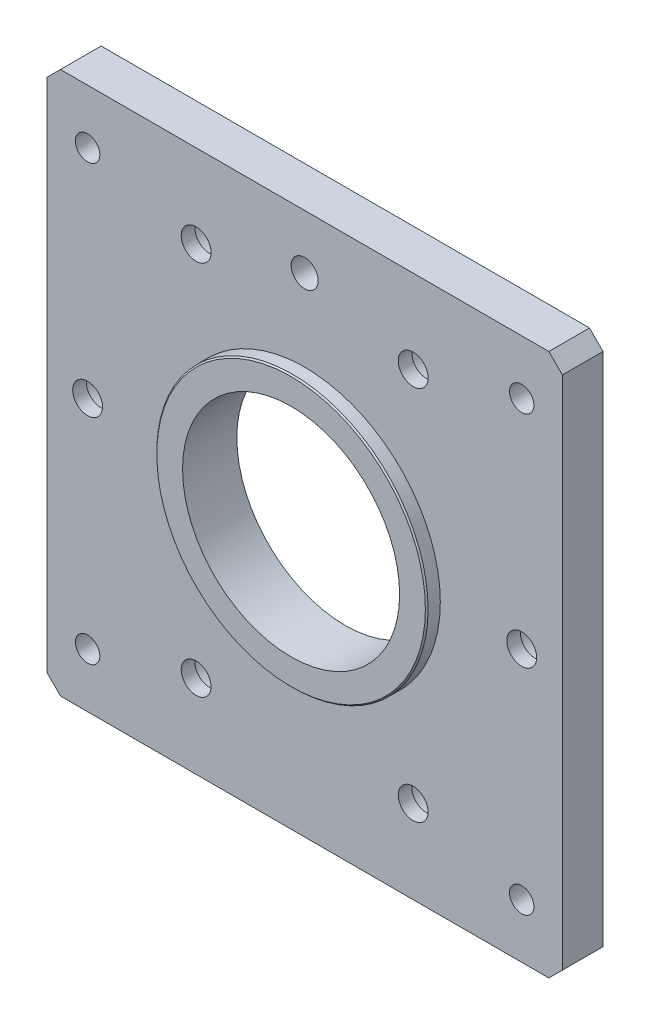
ISO-10303-21;
HEADER;
FILE_DESCRIPTION(('STEP AP214'),'2;1');
FILE_NAME('part.step','',(''),(''),'','','');
FILE_SCHEMA(('AUTOMOTIVE_DESIGN { 1 0 10303 214 1 1 1 1 }'));
ENDSEC;
DATA;
#1=APPLICATION_CONTEXT('core data for automotive mechanical design processes');
#2=APPLICATION_PROTOCOL_DEFINITION('international standard','automotive_design',2000,#1);
#3=PRODUCT_CONTEXT('',#1,'mechanical');
#4=PRODUCT('Part','Part','',(#3));
#5=PRODUCT_RELATED_PRODUCT_CATEGORY('part','',(#4));
#6=PRODUCT_DEFINITION_FORMATION('','',#4);
#7=PRODUCT_DEFINITION_CONTEXT('part definition',#1,'design');
#8=PRODUCT_DEFINITION('design','',#6,#7);
#9=PRODUCT_DEFINITION_SHAPE('','',#8);
#10=(LENGTH_UNIT() NAMED_UNIT(*) SI_UNIT(.MILLI.,.METRE.));
#11=(NAMED_UNIT(*) PLANE_ANGLE_UNIT() SI_UNIT($,.RADIAN.));
#12=(NAMED_UNIT(*) SI_UNIT($,.STERADIAN.) SOLID_ANGLE_UNIT());
#13=UNCERTAINTY_MEASURE_WITH_UNIT(LENGTH_MEASURE(1.E-05),#10,'distance_accuracy_value','');
#14=(GEOMETRIC_REPRESENTATION_CONTEXT(3) GLOBAL_UNCERTAINTY_ASSIGNED_CONTEXT((#13)) GLOBAL_UNIT_ASSIGNED_CONTEXT((#10,
#11,#12)) REPRESENTATION_CONTEXT('',''));
#15=CARTESIAN_POINT('',(0.,0.,0.));
#16=DIRECTION('',(0.,0.,1.));
#17=DIRECTION('',(1.,0.,0.));
#18=AXIS2_PLACEMENT_3D('',#15,#16,#17);
#19=CARTESIAN_POINT('',(0.,0.,0.));
#20=DIRECTION('',(0.,0.,1.));
#21=DIRECTION('',(1.,0.,0.));
#22=AXIS2_PLACEMENT_3D('',#19,#20,#21);
#23=PLANE('',#22);
#24=CARTESIAN_POINT('',(80.0000000000001,80.0000000000001,0.));
#25=DIRECTION('',(0.,0.,-1.));
#26=DIRECTION('',(-1.,0.,0.));
#27=AXIS2_PLACEMENT_3D('',#24,#25,#26);
#28=CIRCLE('',#27,4.5);
#29=CARTESIAN_POINT('',(75.5000000000001,80.0000000000001,0.));
#30=VERTEX_POINT('',#29);
#31=EDGE_CURVE('E202',#30,#30,#28,.T.);
#32=ORIENTED_EDGE('',*,*,#31,.F.);
#33=EDGE_LOOP('',(#32));
#34=FACE_BOUND('',#33,.T.);
#35=CARTESIAN_POINT('',(-80.0000000000001,80.0000000000001,0.));
#36=DIRECTION('',(0.,0.,-1.));
#37=DIRECTION('',(-1.,0.,0.));
#38=AXIS2_PLACEMENT_3D('',#35,#36,#37);
#39=CIRCLE('',#38,4.5);
#40=CARTESIAN_POINT('',(-84.5000000000001,80.0000000000001,0.));
#41=VERTEX_POINT('',#40);
#42=EDGE_CURVE('E192',#41,#41,#39,.T.);
#43=ORIENTED_EDGE('',*,*,#42,.F.);
#44=EDGE_LOOP('',(#43));
#45=FACE_BOUND('',#44,.T.);
#46=CARTESIAN_POINT('',(80.0000000000001,-80.0000000000001,0.));
#47=DIRECTION('',(0.,0.,-1.));
#48=DIRECTION('',(-1.,0.,0.));
#49=AXIS2_PLACEMENT_3D('',#46,#47,#48);
#50=CIRCLE('',#49,4.5);
#51=CARTESIAN_POINT('',(75.5000000000001,-80.0000000000001,0.));
#52=VERTEX_POINT('',#51);
#53=EDGE_CURVE('E189',#52,#52,#50,.T.);
#54=ORIENTED_EDGE('',*,*,#53,.F.);
#55=EDGE_LOOP('',(#54));
#56=FACE_BOUND('',#55,.T.);
#57=CARTESIAN_POINT('',(-80.0000000000001,-80.0000000000001,0.));
#58=DIRECTION('',(0.,0.,-1.));
#59=DIRECTION('',(-1.,0.,0.));
#60=AXIS2_PLACEMENT_3D('',#57,#58,#59);
#61=CIRCLE('',#60,4.5);
#62=CARTESIAN_POINT('',(-84.5000000000001,-80.0000000000001,0.));
#63=VERTEX_POINT('',#62);
#64=EDGE_CURVE('E188',#63,#63,#61,.T.);
#65=ORIENTED_EDGE('',*,*,#64,.F.);
#66=EDGE_LOOP('',(#65));
#67=FACE_BOUND('',#66,.T.);
#68=CARTESIAN_POINT('',(40.0000000000008,69.2820323027546,0.));
#69=DIRECTION('',(0.,0.,-1.));
#70=DIRECTION('',(-1.,0.,0.));
#71=AXIS2_PLACEMENT_3D('',#68,#69,#70);
#72=CIRCLE('',#71,9.);
#73=CARTESIAN_POINT('',(31.0000000000008,69.2820323027546,0.));
#74=VERTEX_POINT('',#73);
#75=EDGE_CURVE('E210',#74,#74,#72,.T.);
#76=ORIENTED_EDGE('',*,*,#75,.F.);
#77=EDGE_LOOP('',(#76));
#78=FACE_BOUND('',#77,.T.);
#79=CARTESIAN_POINT('',(80.,0.,0.));
#80=DIRECTION('',(0.,0.,-1.));
#81=DIRECTION('',(-1.,0.,0.));
#82=AXIS2_PLACEMENT_3D('',#79,#80,#81);
#83=CIRCLE('',#82,8.99999999999999);
#84=CARTESIAN_POINT('',(71.,0.,0.));
#85=VERTEX_POINT('',#84);
#86=EDGE_CURVE('E184',#85,#85,#83,.T.);
#87=ORIENTED_EDGE('',*,*,#86,.F.);
#88=EDGE_LOOP('',(#87));
#89=FACE_BOUND('',#88,.T.);
#90=CARTESIAN_POINT('',(-80.,5.62050406216485E-13,0.));
#91=DIRECTION('',(0.,0.,-1.));
#92=DIRECTION('',(-1.,0.,0.));
#93=AXIS2_PLACEMENT_3D('',#90,#91,#92);
#94=CIRCLE('',#93,8.99999999999999);
#95=CARTESIAN_POINT('',(-89.,5.62050406216485E-13,0.));
#96=VERTEX_POINT('',#95);
#97=EDGE_CURVE('E179',#96,#96,#94,.T.);
#98=ORIENTED_EDGE('',*,*,#97,.F.);
#99=EDGE_LOOP('',(#98));
#100=FACE_BOUND('',#99,.T.);
#101=CARTESIAN_POINT('',(-40.0000000000003,-69.2820323027549,0.));
#102=DIRECTION('',(0.,0.,-1.));
#103=DIRECTION('',(-1.,0.,0.));
#104=AXIS2_PLACEMENT_3D('',#101,#102,#103);
#105=CIRCLE('',#104,9.);
#106=CARTESIAN_POINT('',(-49.0000000000003,-69.2820323027549,0.));
#107=VERTEX_POINT('',#106);
#108=EDGE_CURVE('E174',#107,#107,#105,.T.);
#109=ORIENTED_EDGE('',*,*,#108,.F.);
#110=EDGE_LOOP('',(#109));
#111=FACE_BOUND('',#110,.T.);
#112=CARTESIAN_POINT('',(39.9999999999998,-69.2820323027552,0.));
#113=DIRECTION('',(0.,0.,-1.));
#114=DIRECTION('',(-1.,0.,0.));
#115=AXIS2_PLACEMENT_3D('',#112,#113,#114);
#116=CIRCLE('',#115,8.99999999999999);
#117=CARTESIAN_POINT('',(30.9999999999998,-69.2820323027552,0.));
#118=VERTEX_POINT('',#117);
#119=EDGE_CURVE('E169',#118,#118,#116,.T.);
#120=ORIENTED_EDGE('',*,*,#119,.F.);
#121=EDGE_LOOP('',(#120));
#122=FACE_BOUND('',#121,.T.);
#123=CARTESIAN_POINT('',(0.,0.,0.));
#124=DIRECTION('',(0.,0.,1.));
#125=DIRECTION('',(1.,0.,0.));
#126=AXIS2_PLACEMENT_3D('',#123,#124,#125);
#127=CIRCLE('',#126,40.);
#128=CARTESIAN_POINT('',(40.,0.,0.));
#129=VERTEX_POINT('',#128);
#130=EDGE_CURVE('E125',#129,#129,#127,.T.);
#131=ORIENTED_EDGE('',*,*,#130,.T.);
#132=EDGE_LOOP('',(#131));
#133=FACE_BOUND('',#132,.T.);
#134=CARTESIAN_POINT('',(0.,80.,0.));
#135=DIRECTION('',(0.,0.,1.));
#136=DIRECTION('',(1.,0.,0.));
#137=AXIS2_PLACEMENT_3D('',#134,#135,#136);
#138=CIRCLE('',#137,5.);
#139=CARTESIAN_POINT('',(5.,80.,0.));
#140=VERTEX_POINT('',#139);
#141=EDGE_CURVE('E265',#140,#140,#138,.T.);
#142=ORIENTED_EDGE('',*,*,#141,.T.);
#143=EDGE_LOOP('',(#142));
#144=FACE_BOUND('',#143,.T.);
#145=DIRECTION('',(0.,1.,0.));
#146=VECTOR('',#145,1.);
#147=CARTESIAN_POINT('',(94.9999999999999,100.,0.));
#148=LINE('',#147,#146);
#149=CARTESIAN_POINT('',(95.,-94.9999999999999,0.));
#150=VERTEX_POINT('',#149);
#151=CARTESIAN_POINT('',(94.9999999999999,94.9999999999999,0.));
#152=VERTEX_POINT('',#151);
#153=EDGE_CURVE('E270',#150,#152,#148,.T.);
#154=ORIENTED_EDGE('',*,*,#153,.F.);
#155=DIRECTION('',(0.707106781186548,0.707106781186547,0.));
#156=VECTOR('',#155,1.);
#157=CARTESIAN_POINT('',(95.,-94.9999999999999,0.));
#158=LINE('',#157,#156);
#159=CARTESIAN_POINT('',(89.9999999999999,-99.9999999999999,0.));
#160=VERTEX_POINT('',#159);
#161=EDGE_CURVE('E129',#150,#160,#158,.F.);
#162=ORIENTED_EDGE('',*,*,#161,.T.);
#163=DIRECTION('',(1.,0.,0.));
#164=VECTOR('',#163,1.);
#165=CARTESIAN_POINT('',(-95.,-99.9999999999999,0.));
#166=LINE('',#165,#164);
#167=CARTESIAN_POINT('',(-90.,-99.9999999999999,0.));
#168=VERTEX_POINT('',#167);
#169=EDGE_CURVE('E277',#168,#160,#166,.T.);
#170=ORIENTED_EDGE('',*,*,#169,.F.);
#171=DIRECTION('',(0.707106781186546,-0.70710678118655,0.));
#172=VECTOR('',#171,1.);
#173=CARTESIAN_POINT('',(-90.,-99.9999999999999,0.));
#174=LINE('',#173,#172);
#175=CARTESIAN_POINT('',(-95.,-94.9999999999998,0.));
#176=VERTEX_POINT('',#175);
#177=EDGE_CURVE('E139',#168,#176,#174,.F.);
#178=ORIENTED_EDGE('',*,*,#177,.T.);
#179=DIRECTION('',(0.,-1.,0.));
#180=VECTOR('',#179,1.);
#181=CARTESIAN_POINT('',(-95.0000000000001,100.,0.));
#182=LINE('',#181,#180);
#183=CARTESIAN_POINT('',(-95.0000000000001,95.0000000000001,0.));
#184=VERTEX_POINT('',#183);
#185=EDGE_CURVE('E275',#184,#176,#182,.T.);
#186=ORIENTED_EDGE('',*,*,#185,.F.);
#187=DIRECTION('',(-0.707106781186548,-0.707106781186548,0.));
#188=VECTOR('',#187,1.);
#189=CARTESIAN_POINT('',(-95.0000000000001,95.0000000000001,0.));
#190=LINE('',#189,#188);
#191=CARTESIAN_POINT('',(-90.0000000000001,100.,0.));
#192=VERTEX_POINT('',#191);
#193=EDGE_CURVE('E132',#184,#192,#190,.F.);
#194=ORIENTED_EDGE('',*,*,#193,.T.);
#195=DIRECTION('',(-1.,0.,0.));
#196=VECTOR('',#195,1.);
#197=CARTESIAN_POINT('',(-95.0000000000001,100.,0.));
#198=LINE('',#197,#196);
#199=CARTESIAN_POINT('',(89.9999999999998,100.,0.));
#200=VERTEX_POINT('',#199);
#201=EDGE_CURVE('E272',#200,#192,#198,.T.);
#202=ORIENTED_EDGE('',*,*,#201,.F.);
#203=DIRECTION('',(-0.707106781186547,0.707106781186549,0.));
#204=VECTOR('',#203,1.);
#205=CARTESIAN_POINT('',(89.9999999999998,100.,0.));
#206=LINE('',#205,#204);
#207=EDGE_CURVE('E130',#200,#152,#206,.F.);
#208=ORIENTED_EDGE('',*,*,#207,.T.);
#209=EDGE_LOOP('',(#154,#162,#170,#178,#186,#194,#202,#208));
#210=FACE_BOUND('',#209,.T.);
#211=CARTESIAN_POINT('',(-39.9999999999994,69.2820323027554,0.));
#212=DIRECTION('',(0.,0.,-1.));
#213=DIRECTION('',(-1.,0.,0.));
#214=AXIS2_PLACEMENT_3D('',#211,#212,#213);
#215=CIRCLE('',#214,9.);
#216=CARTESIAN_POINT('',(-48.9999999999993,69.2820323027554,0.));
#217=VERTEX_POINT('',#216);
#218=EDGE_CURVE('E164',#217,#217,#215,.T.);
#219=ORIENTED_EDGE('',*,*,#218,.F.);
#220=EDGE_LOOP('',(#219));
#221=FACE_BOUND('',#220,.T.);
#222=ADVANCED_FACE('F36',(#34,#45,#56,#67,#78,#89,#100,#111,#122,#133,#144,#210,#221),#23,.F.);
#223=CARTESIAN_POINT('',(0.,0.,20.));
#224=DIRECTION('',(0.,0.,1.));
#225=DIRECTION('',(1.,0.,0.));
#226=AXIS2_PLACEMENT_3D('',#223,#224,#225);
#227=PLANE('',#226);
#228=CARTESIAN_POINT('',(0.,0.,20.));
#229=DIRECTION('',(0.,0.,1.));
#230=DIRECTION('',(1.,0.,0.));
#231=AXIS2_PLACEMENT_3D('',#228,#229,#230);
#232=CIRCLE('',#231,49.5);
#233=CARTESIAN_POINT('',(49.5,0.,20.));
#234=VERTEX_POINT('',#233);
#235=EDGE_CURVE('E280',#234,#234,#232,.T.);
#236=ORIENTED_EDGE('',*,*,#235,.T.);
#237=EDGE_LOOP('',(#236));
#238=FACE_BOUND('',#237,.T.);
#239=CARTESIAN_POINT('',(0.,0.,20.));
#240=DIRECTION('',(0.,0.,1.));
#241=DIRECTION('',(1.,0.,0.));
#242=AXIS2_PLACEMENT_3D('',#239,#240,#241);
#243=CIRCLE('',#242,40.);
#244=CARTESIAN_POINT('',(40.,0.,20.));
#245=VERTEX_POINT('',#244);
#246=EDGE_CURVE('E262',#245,#245,#243,.T.);
#247=ORIENTED_EDGE('',*,*,#246,.F.);
#248=EDGE_LOOP('',(#247));
#249=FACE_BOUND('',#248,.T.);
#250=ADVANCED_FACE('F294',(#238,#249),#227,.T.);
#251=CARTESIAN_POINT('',(94.9999999999999,100.,20.));
#252=DIRECTION('',(-1.,0.,0.));
#253=DIRECTION('',(0.,-1.,0.));
#254=AXIS2_PLACEMENT_3D('',#251,#252,#253);
#255=PLANE('',#254);
#256=DIRECTION('',(0.,1.,0.));
#257=VECTOR('',#256,1.);
#258=CARTESIAN_POINT('',(94.9999999999999,100.,15.));
#259=LINE('',#258,#257);
#260=CARTESIAN_POINT('',(95.,-94.9999999999999,15.));
#261=VERTEX_POINT('',#260);
#262=CARTESIAN_POINT('',(94.9999999999999,94.9999999999999,15.));
#263=VERTEX_POINT('',#262);
#264=EDGE_CURVE('E107',#261,#263,#259,.T.);
#265=ORIENTED_EDGE('',*,*,#264,.F.);
#266=DIRECTION('',(0.,0.,-1.));
#267=VECTOR('',#266,1.);
#268=CARTESIAN_POINT('',(95.,-94.9999999999999,20.));
#269=LINE('',#268,#267);
#270=EDGE_CURVE('E121',#261,#150,#269,.T.);
#271=ORIENTED_EDGE('',*,*,#270,.T.);
#272=ORIENTED_EDGE('',*,*,#153,.T.);
#273=DIRECTION('',(0.,0.,1.));
#274=VECTOR('',#273,1.);
#275=CARTESIAN_POINT('',(94.9999999999999,94.9999999999999,20.));
#276=LINE('',#275,#274);
#277=EDGE_CURVE('E124',#152,#263,#276,.T.);
#278=ORIENTED_EDGE('',*,*,#277,.T.);
#279=EDGE_LOOP('',(#265,#271,#272,#278));
#280=FACE_BOUND('',#279,.T.);
#281=ADVANCED_FACE('F119',(#280),#255,.F.);
#282=CARTESIAN_POINT('',(-95.0000000000001,100.,20.));
#283=DIRECTION('',(0.,-1.,0.));
#284=DIRECTION('',(1.,0.,0.));
#285=AXIS2_PLACEMENT_3D('',#282,#283,#284);
#286=PLANE('',#285);
#287=ORIENTED_EDGE('',*,*,#201,.T.);
#288=DIRECTION('',(0.,0.,1.));
#289=VECTOR('',#288,1.);
#290=CARTESIAN_POINT('',(-90.0000000000001,100.,20.));
#291=LINE('',#290,#289);
#292=CARTESIAN_POINT('',(-90.0000000000001,100.,15.));
#293=VERTEX_POINT('',#292);
#294=EDGE_CURVE('E12',#192,#293,#291,.T.);
#295=ORIENTED_EDGE('',*,*,#294,.T.);
#296=DIRECTION('',(-1.,0.,0.));
#297=VECTOR('',#296,1.);
#298=CARTESIAN_POINT('',(-95.0000000000001,100.,15.));
#299=LINE('',#298,#297);
#300=CARTESIAN_POINT('',(89.9999999999998,100.,15.));
#301=VERTEX_POINT('',#300);
#302=EDGE_CURVE('E126',#301,#293,#299,.T.);
#303=ORIENTED_EDGE('',*,*,#302,.F.);
#304=DIRECTION('',(0.,0.,-1.));
#305=VECTOR('',#304,1.);
#306=CARTESIAN_POINT('',(89.9999999999998,100.,20.));
#307=LINE('',#306,#305);
#308=EDGE_CURVE('E45',#301,#200,#307,.T.);
#309=ORIENTED_EDGE('',*,*,#308,.T.);
#310=EDGE_LOOP('',(#287,#295,#303,#309));
#311=FACE_BOUND('',#310,.T.);
#312=ADVANCED_FACE('F353',(#311),#286,.F.);
#313=CARTESIAN_POINT('',(-95.0000000000001,100.,20.));
#314=DIRECTION('',(1.,0.,0.));
#315=DIRECTION('',(0.,1.,0.));
#316=AXIS2_PLACEMENT_3D('',#313,#314,#315);
#317=PLANE('',#316);
#318=ORIENTED_EDGE('',*,*,#185,.T.);
#319=DIRECTION('',(0.,0.,1.));
#320=VECTOR('',#319,1.);
#321=CARTESIAN_POINT('',(-95.,-94.9999999999998,20.));
#322=LINE('',#321,#320);
#323=CARTESIAN_POINT('',(-95.,-94.9999999999998,15.));
#324=VERTEX_POINT('',#323);
#325=EDGE_CURVE('E53',#176,#324,#322,.T.);
#326=ORIENTED_EDGE('',*,*,#325,.T.);
#327=DIRECTION('',(0.,-1.,0.));
#328=VECTOR('',#327,1.);
#329=CARTESIAN_POINT('',(-95.0000000000001,100.,15.));
#330=LINE('',#329,#328);
#331=CARTESIAN_POINT('',(-95.0000000000001,95.0000000000001,15.));
#332=VERTEX_POINT('',#331);
#333=EDGE_CURVE('E259',#332,#324,#330,.T.);
#334=ORIENTED_EDGE('',*,*,#333,.F.);
#335=DIRECTION('',(0.,0.,-1.));
#336=VECTOR('',#335,1.);
#337=CARTESIAN_POINT('',(-95.0000000000001,95.0000000000001,20.));
#338=LINE('',#337,#336);
#339=EDGE_CURVE('E114',#332,#184,#338,.T.);
#340=ORIENTED_EDGE('',*,*,#339,.T.);
#341=EDGE_LOOP('',(#318,#326,#334,#340));
#342=FACE_BOUND('',#341,.T.);
#343=ADVANCED_FACE('F349',(#342),#317,.F.);
#344=CARTESIAN_POINT('',(-95.,-99.9999999999999,20.));
#345=DIRECTION('',(0.,1.,0.));
#346=DIRECTION('',(0.,0.,1.));
#347=AXIS2_PLACEMENT_3D('',#344,#345,#346);
#348=PLANE('',#347);
#349=ORIENTED_EDGE('',*,*,#169,.T.);
#350=DIRECTION('',(0.,0.,1.));
#351=VECTOR('',#350,1.);
#352=CARTESIAN_POINT('',(89.9999999999999,-99.9999999999999,20.));
#353=LINE('',#352,#351);
#354=CARTESIAN_POINT('',(89.9999999999999,-99.9999999999999,15.));
#355=VERTEX_POINT('',#354);
#356=EDGE_CURVE('E145',#160,#355,#353,.T.);
#357=ORIENTED_EDGE('',*,*,#356,.T.);
#358=DIRECTION('',(1.,0.,0.));
#359=VECTOR('',#358,1.);
#360=CARTESIAN_POINT('',(-95.,-99.9999999999999,15.));
#361=LINE('',#360,#359);
#362=CARTESIAN_POINT('',(-90.,-99.9999999999999,15.));
#363=VERTEX_POINT('',#362);
#364=EDGE_CURVE('E110',#363,#355,#361,.T.);
#365=ORIENTED_EDGE('',*,*,#364,.F.);
#366=DIRECTION('',(0.,0.,-1.));
#367=VECTOR('',#366,1.);
#368=CARTESIAN_POINT('',(-90.,-99.9999999999999,20.));
#369=LINE('',#368,#367);
#370=EDGE_CURVE('E142',#363,#168,#369,.T.);
#371=ORIENTED_EDGE('',*,*,#370,.T.);
#372=EDGE_LOOP('',(#349,#357,#365,#371));
#373=FACE_BOUND('',#372,.T.);
#374=ADVANCED_FACE('F344',(#373),#348,.F.);
#375=CARTESIAN_POINT('',(0.,80.,20.));
#376=DIRECTION('',(0.,0.,-1.));
#377=DIRECTION('',(-1.,0.,0.));
#378=AXIS2_PLACEMENT_3D('',#375,#376,#377);
#379=CYLINDRICAL_SURFACE('',#378,5.);
#380=ORIENTED_EDGE('',*,*,#141,.F.);
#381=EDGE_LOOP('',(#380));
#382=FACE_BOUND('',#381,.T.);
#383=CARTESIAN_POINT('',(0.,80.,15.));
#384=DIRECTION('',(0.,0.,1.));
#385=DIRECTION('',(1.,0.,0.));
#386=AXIS2_PLACEMENT_3D('',#383,#384,#385);
#387=CIRCLE('',#386,5.);
#388=CARTESIAN_POINT('',(5.,80.,15.));
#389=VERTEX_POINT('',#388);
#390=EDGE_CURVE('E255',#389,#389,#387,.T.);
#391=ORIENTED_EDGE('',*,*,#390,.T.);
#392=EDGE_LOOP('',(#391));
#393=FACE_BOUND('',#392,.T.);
#394=ADVANCED_FACE('F303',(#382,#393),#379,.F.);
#395=CARTESIAN_POINT('',(0.,0.,20.));
#396=DIRECTION('',(0.,0.,-1.));
#397=DIRECTION('',(-1.,0.,0.));
#398=AXIS2_PLACEMENT_3D('',#395,#396,#397);
#399=CYLINDRICAL_SURFACE('',#398,40.);
#400=ORIENTED_EDGE('',*,*,#246,.T.);
#401=EDGE_LOOP('',(#400));
#402=FACE_BOUND('',#401,.T.);
#403=ORIENTED_EDGE('',*,*,#130,.F.);
#404=EDGE_LOOP('',(#403));
#405=FACE_BOUND('',#404,.T.);
#406=ADVANCED_FACE('F300',(#402,#405),#399,.F.);
#407=CARTESIAN_POINT('',(0.,0.,15.));
#408=DIRECTION('',(0.,0.,1.));
#409=DIRECTION('',(1.,0.,0.));
#410=AXIS2_PLACEMENT_3D('',#407,#408,#409);
#411=PLANE('',#410);
#412=CARTESIAN_POINT('',(80.0000000000001,80.0000000000001,15.));
#413=DIRECTION('',(0.,0.,1.));
#414=DIRECTION('',(1.,0.,0.));
#415=AXIS2_PLACEMENT_3D('',#412,#413,#414);
#416=CIRCLE('',#415,4.5);
#417=CARTESIAN_POINT('',(84.5000000000001,80.0000000000001,15.));
#418=VERTEX_POINT('',#417);
#419=EDGE_CURVE('E40',#418,#418,#416,.T.);
#420=ORIENTED_EDGE('',*,*,#419,.F.);
#421=EDGE_LOOP('',(#420));
#422=FACE_BOUND('',#421,.T.);
#423=CARTESIAN_POINT('',(-80.0000000000001,80.0000000000001,15.));
#424=DIRECTION('',(0.,0.,1.));
#425=DIRECTION('',(1.,0.,0.));
#426=AXIS2_PLACEMENT_3D('',#423,#424,#425);
#427=CIRCLE('',#426,4.5);
#428=CARTESIAN_POINT('',(-75.5000000000001,80.0000000000001,15.));
#429=VERTEX_POINT('',#428);
#430=EDGE_CURVE('E190',#429,#429,#427,.T.);
#431=ORIENTED_EDGE('',*,*,#430,.F.);
#432=EDGE_LOOP('',(#431));
#433=FACE_BOUND('',#432,.T.);
#434=CARTESIAN_POINT('',(80.0000000000001,-80.0000000000001,15.));
#435=DIRECTION('',(0.,0.,1.));
#436=DIRECTION('',(1.,0.,0.));
#437=AXIS2_PLACEMENT_3D('',#434,#435,#436);
#438=CIRCLE('',#437,4.5);
#439=CARTESIAN_POINT('',(84.5000000000001,-80.0000000000001,15.));
#440=VERTEX_POINT('',#439);
#441=EDGE_CURVE('E186',#440,#440,#438,.T.);
#442=ORIENTED_EDGE('',*,*,#441,.F.);
#443=EDGE_LOOP('',(#442));
#444=FACE_BOUND('',#443,.T.);
#445=CARTESIAN_POINT('',(-80.0000000000001,-80.0000000000001,15.));
#446=DIRECTION('',(0.,0.,1.));
#447=DIRECTION('',(1.,0.,0.));
#448=AXIS2_PLACEMENT_3D('',#445,#446,#447);
#449=CIRCLE('',#448,4.5);
#450=CARTESIAN_POINT('',(-75.5000000000001,-80.0000000000001,15.));
#451=VERTEX_POINT('',#450);
#452=EDGE_CURVE('E207',#451,#451,#449,.T.);
#453=ORIENTED_EDGE('',*,*,#452,.F.);
#454=EDGE_LOOP('',(#453));
#455=FACE_BOUND('',#454,.T.);
#456=CARTESIAN_POINT('',(40.0000000000008,69.2820323027546,15.));
#457=DIRECTION('',(0.,0.,1.));
#458=DIRECTION('',(1.,0.,0.));
#459=AXIS2_PLACEMENT_3D('',#456,#457,#458);
#460=CIRCLE('',#459,5.5);
#461=CARTESIAN_POINT('',(45.5000000000008,69.2820323027546,15.));
#462=VERTEX_POINT('',#461);
#463=EDGE_CURVE('E181',#462,#462,#460,.T.);
#464=ORIENTED_EDGE('',*,*,#463,.F.);
#465=EDGE_LOOP('',(#464));
#466=FACE_BOUND('',#465,.T.);
#467=CARTESIAN_POINT('',(80.,0.,15.));
#468=DIRECTION('',(0.,0.,1.));
#469=DIRECTION('',(1.,0.,0.));
#470=AXIS2_PLACEMENT_3D('',#467,#468,#469);
#471=CIRCLE('',#470,5.5);
#472=CARTESIAN_POINT('',(85.5,0.,15.));
#473=VERTEX_POINT('',#472);
#474=EDGE_CURVE('E176',#473,#473,#471,.T.);
#475=ORIENTED_EDGE('',*,*,#474,.F.);
#476=EDGE_LOOP('',(#475));
#477=FACE_BOUND('',#476,.T.);
#478=CARTESIAN_POINT('',(-80.,5.62050406216485E-13,15.));
#479=DIRECTION('',(0.,0.,1.));
#480=DIRECTION('',(1.,0.,0.));
#481=AXIS2_PLACEMENT_3D('',#478,#479,#480);
#482=CIRCLE('',#481,5.5);
#483=CARTESIAN_POINT('',(-74.5,5.62050406216485E-13,15.));
#484=VERTEX_POINT('',#483);
#485=EDGE_CURVE('E171',#484,#484,#482,.T.);
#486=ORIENTED_EDGE('',*,*,#485,.F.);
#487=EDGE_LOOP('',(#486));
#488=FACE_BOUND('',#487,.T.);
#489=CARTESIAN_POINT('',(-40.0000000000003,-69.2820323027549,15.));
#490=DIRECTION('',(0.,0.,1.));
#491=DIRECTION('',(1.,0.,0.));
#492=AXIS2_PLACEMENT_3D('',#489,#490,#491);
#493=CIRCLE('',#492,5.5);
#494=CARTESIAN_POINT('',(-34.5000000000003,-69.2820323027549,15.));
#495=VERTEX_POINT('',#494);
#496=EDGE_CURVE('E166',#495,#495,#493,.T.);
#497=ORIENTED_EDGE('',*,*,#496,.F.);
#498=EDGE_LOOP('',(#497));
#499=FACE_BOUND('',#498,.T.);
#500=CARTESIAN_POINT('',(39.9999999999998,-69.2820323027552,15.));
#501=DIRECTION('',(0.,0.,1.));
#502=DIRECTION('',(1.,0.,0.));
#503=AXIS2_PLACEMENT_3D('',#500,#501,#502);
#504=CIRCLE('',#503,5.49999999999999);
#505=CARTESIAN_POINT('',(45.4999999999998,-69.2820323027552,15.));
#506=VERTEX_POINT('',#505);
#507=EDGE_CURVE('E161',#506,#506,#504,.T.);
#508=ORIENTED_EDGE('',*,*,#507,.F.);
#509=EDGE_LOOP('',(#508));
#510=FACE_BOUND('',#509,.T.);
#511=CARTESIAN_POINT('',(-39.9999999999994,69.2820323027554,15.));
#512=DIRECTION('',(0.,0.,1.));
#513=DIRECTION('',(1.,0.,0.));
#514=AXIS2_PLACEMENT_3D('',#511,#512,#513);
#515=CIRCLE('',#514,5.49999999999999);
#516=CARTESIAN_POINT('',(-34.4999999999994,69.2820323027554,15.));
#517=VERTEX_POINT('',#516);
#518=EDGE_CURVE('E156',#517,#517,#515,.T.);
#519=ORIENTED_EDGE('',*,*,#518,.F.);
#520=EDGE_LOOP('',(#519));
#521=FACE_BOUND('',#520,.T.);
#522=CARTESIAN_POINT('',(0.,0.,15.));
#523=DIRECTION('',(0.,0.,1.));
#524=DIRECTION('',(1.,0.,0.));
#525=AXIS2_PLACEMENT_3D('',#522,#523,#524);
#526=CIRCLE('',#525,50.);
#527=CARTESIAN_POINT('',(50.,0.,15.));
#528=VERTEX_POINT('',#527);
#529=EDGE_CURVE('E159',#528,#528,#526,.T.);
#530=ORIENTED_EDGE('',*,*,#529,.F.);
#531=EDGE_LOOP('',(#530));
#532=FACE_BOUND('',#531,.T.);
#533=ORIENTED_EDGE('',*,*,#390,.F.);
#534=EDGE_LOOP('',(#533));
#535=FACE_BOUND('',#534,.T.);
#536=ORIENTED_EDGE('',*,*,#364,.T.);
#537=DIRECTION('',(-0.707106781186548,-0.707106781186547,0.));
#538=VECTOR('',#537,1.);
#539=CARTESIAN_POINT('',(94.9999999999998,-95.,15.));
#540=LINE('',#539,#538);
#541=EDGE_CURVE('E104',#355,#261,#540,.F.);
#542=ORIENTED_EDGE('',*,*,#541,.T.);
#543=ORIENTED_EDGE('',*,*,#264,.T.);
#544=DIRECTION('',(0.707106781186547,-0.707106781186549,0.));
#545=VECTOR('',#544,1.);
#546=CARTESIAN_POINT('',(95.,94.9999999999999,15.));
#547=LINE('',#546,#545);
#548=EDGE_CURVE('E147',#263,#301,#547,.F.);
#549=ORIENTED_EDGE('',*,*,#548,.T.);
#550=ORIENTED_EDGE('',*,*,#302,.T.);
#551=DIRECTION('',(0.707106781186548,0.707106781186548,0.));
#552=VECTOR('',#551,1.);
#553=CARTESIAN_POINT('',(-95.,95.0000000000001,15.));
#554=LINE('',#553,#552);
#555=EDGE_CURVE('E60',#293,#332,#554,.F.);
#556=ORIENTED_EDGE('',*,*,#555,.T.);
#557=ORIENTED_EDGE('',*,*,#333,.T.);
#558=DIRECTION('',(-0.707106781186546,0.70710678118655,0.));
#559=VECTOR('',#558,1.);
#560=CARTESIAN_POINT('',(-95.0000000000003,-94.9999999999996,15.));
#561=LINE('',#560,#559);
#562=EDGE_CURVE('E115',#324,#363,#561,.F.);
#563=ORIENTED_EDGE('',*,*,#562,.T.);
#564=EDGE_LOOP('',(#536,#542,#543,#549,#550,#556,#557,#563));
#565=FACE_BOUND('',#564,.T.);
#566=ADVANCED_FACE('F106',(#422,#433,#444,#455,#466,#477,#488,#499,#510,#521,#532,#535,#565),
#411,.T.);
#567=CARTESIAN_POINT('',(0.,0.,15.));
#568=DIRECTION('',(0.,0.,1.));
#569=DIRECTION('',(1.,0.,0.));
#570=AXIS2_PLACEMENT_3D('',#567,#568,#569);
#571=CYLINDRICAL_SURFACE('',#570,50.);
#572=CARTESIAN_POINT('',(0.,0.,19.5));
#573=DIRECTION('',(0.,0.,1.));
#574=DIRECTION('',(1.,0.,0.));
#575=AXIS2_PLACEMENT_3D('',#572,#573,#574);
#576=CIRCLE('',#575,50.);
#577=CARTESIAN_POINT('',(50.,0.,19.5));
#578=VERTEX_POINT('',#577);
#579=EDGE_CURVE('E134',#578,#578,#576,.F.);
#580=ORIENTED_EDGE('',*,*,#579,.T.);
#581=EDGE_LOOP('',(#580));
#582=FACE_BOUND('',#581,.T.);
#583=ORIENTED_EDGE('',*,*,#529,.T.);
#584=EDGE_LOOP('',(#583));
#585=FACE_BOUND('',#584,.T.);
#586=ADVANCED_FACE('F285',(#582,#585),#571,.T.);
#587=CARTESIAN_POINT('',(0.,0.,20.));
#588=DIRECTION('',(0.,0.,-1.));
#589=DIRECTION('',(-1.,0.,0.));
#590=AXIS2_PLACEMENT_3D('',#587,#588,#589);
#591=CONICAL_SURFACE('',#590,49.5,0.785398163397455);
#592=ORIENTED_EDGE('',*,*,#579,.F.);
#593=EDGE_LOOP('',(#592));
#594=FACE_BOUND('',#593,.T.);
#595=ORIENTED_EDGE('',*,*,#235,.F.);
#596=EDGE_LOOP('',(#595));
#597=FACE_BOUND('',#596,.T.);
#598=ADVANCED_FACE('F288',(#594,#597),#591,.T.);
#599=CARTESIAN_POINT('',(95.,-94.9999999999999,20.));
#600=DIRECTION('',(-0.707106781186547,0.707106781186548,0.));
#601=DIRECTION('',(0.,0.,-1.));
#602=AXIS2_PLACEMENT_3D('',#599,#600,#601);
#603=PLANE('',#602);
#604=ORIENTED_EDGE('',*,*,#541,.F.);
#605=ORIENTED_EDGE('',*,*,#356,.F.);
#606=ORIENTED_EDGE('',*,*,#161,.F.);
#607=ORIENTED_EDGE('',*,*,#270,.F.);
#608=EDGE_LOOP('',(#604,#605,#606,#607));
#609=FACE_BOUND('',#608,.T.);
#610=ADVANCED_FACE('F128',(#609),#603,.F.);
#611=CARTESIAN_POINT('',(-90.,-99.9999999999999,20.));
#612=DIRECTION('',(0.707106781186549,0.707106781186545,0.));
#613=DIRECTION('',(0.,0.,-1.));
#614=AXIS2_PLACEMENT_3D('',#611,#612,#613);
#615=PLANE('',#614);
#616=ORIENTED_EDGE('',*,*,#562,.F.);
#617=ORIENTED_EDGE('',*,*,#325,.F.);
#618=ORIENTED_EDGE('',*,*,#177,.F.);
#619=ORIENTED_EDGE('',*,*,#370,.F.);
#620=EDGE_LOOP('',(#616,#617,#618,#619));
#621=FACE_BOUND('',#620,.T.);
#622=ADVANCED_FACE('F361',(#621),#615,.F.);
#623=CARTESIAN_POINT('',(-95.0000000000001,95.0000000000001,20.));
#624=DIRECTION('',(0.707106781186548,-0.707106781186548,0.));
#625=DIRECTION('',(0.,0.,-1.));
#626=AXIS2_PLACEMENT_3D('',#623,#624,#625);
#627=PLANE('',#626);
#628=ORIENTED_EDGE('',*,*,#555,.F.);
#629=ORIENTED_EDGE('',*,*,#294,.F.);
#630=ORIENTED_EDGE('',*,*,#193,.F.);
#631=ORIENTED_EDGE('',*,*,#339,.F.);
#632=EDGE_LOOP('',(#628,#629,#630,#631));
#633=FACE_BOUND('',#632,.T.);
#634=ADVANCED_FACE('F363',(#633),#627,.F.);
#635=CARTESIAN_POINT('',(89.9999999999998,100.,20.));
#636=DIRECTION('',(-0.707106781186549,-0.707106781186547,0.));
#637=DIRECTION('',(0.,0.,-1.));
#638=AXIS2_PLACEMENT_3D('',#635,#636,#637);
#639=PLANE('',#638);
#640=ORIENTED_EDGE('',*,*,#548,.F.);
#641=ORIENTED_EDGE('',*,*,#277,.F.);
#642=ORIENTED_EDGE('',*,*,#207,.F.);
#643=ORIENTED_EDGE('',*,*,#308,.F.);
#644=EDGE_LOOP('',(#640,#641,#642,#643));
#645=FACE_BOUND('',#644,.T.);
#646=ADVANCED_FACE('F38',(#645),#639,.F.);
#647=CARTESIAN_POINT('',(-39.9999999999994,69.2820323027554,0.));
#648=DIRECTION('',(0.,0.,-1.));
#649=DIRECTION('',(-1.,0.,0.));
#650=AXIS2_PLACEMENT_3D('',#647,#648,#649);
#651=CYLINDRICAL_SURFACE('',#650,5.49999999999999);
#652=ORIENTED_EDGE('',*,*,#518,.T.);
#653=EDGE_LOOP('',(#652));
#654=FACE_BOUND('',#653,.T.);
#655=CARTESIAN_POINT('',(-39.9999999999994,69.2820323027554,10.));
#656=DIRECTION('',(0.,0.,-1.));
#657=DIRECTION('',(-1.,0.,0.));
#658=AXIS2_PLACEMENT_3D('',#655,#656,#657);
#659=CIRCLE('',#658,5.5);
#660=CARTESIAN_POINT('',(-45.4999999999994,69.2820323027554,10.));
#661=VERTEX_POINT('',#660);
#662=EDGE_CURVE('E160',#661,#661,#659,.T.);
#663=ORIENTED_EDGE('',*,*,#662,.T.);
#664=EDGE_LOOP('',(#663));
#665=FACE_BOUND('',#664,.T.);
#666=ADVANCED_FACE('F329',(#654,#665),#651,.F.);
#667=CARTESIAN_POINT('',(-34.4999999999994,69.2820323027554,10.));
#668=DIRECTION('',(0.,0.,1.));
#669=DIRECTION('',(1.,0.,0.));
#670=AXIS2_PLACEMENT_3D('',#667,#668,#669);
#671=PLANE('',#670);
#672=ORIENTED_EDGE('',*,*,#662,.F.);
#673=EDGE_LOOP('',(#672));
#674=FACE_BOUND('',#673,.T.);
#675=CARTESIAN_POINT('',(-39.9999999999994,69.2820323027554,10.));
#676=DIRECTION('',(0.,0.,-1.));
#677=DIRECTION('',(-1.,0.,0.));
#678=AXIS2_PLACEMENT_3D('',#675,#676,#677);
#679=CIRCLE('',#678,9.);
#680=CARTESIAN_POINT('',(-48.9999999999993,69.2820323027554,10.));
#681=VERTEX_POINT('',#680);
#682=EDGE_CURVE('E248',#681,#681,#679,.T.);
#683=ORIENTED_EDGE('',*,*,#682,.T.);
#684=EDGE_LOOP('',(#683));
#685=FACE_BOUND('',#684,.T.);
#686=ADVANCED_FACE('F319',(#674,#685),#671,.F.);
#687=CARTESIAN_POINT('',(-39.9999999999994,69.2820323027554,0.));
#688=DIRECTION('',(0.,0.,-1.));
#689=DIRECTION('',(-1.,0.,0.));
#690=AXIS2_PLACEMENT_3D('',#687,#688,#689);
#691=CYLINDRICAL_SURFACE('',#690,9.);
#692=ORIENTED_EDGE('',*,*,#682,.F.);
#693=EDGE_LOOP('',(#692));
#694=FACE_BOUND('',#693,.T.);
#695=ORIENTED_EDGE('',*,*,#218,.T.);
#696=EDGE_LOOP('',(#695));
#697=FACE_BOUND('',#696,.T.);
#698=ADVANCED_FACE('F316',(#694,#697),#691,.F.);
#699=CARTESIAN_POINT('',(39.9999999999998,-69.2820323027552,0.));
#700=DIRECTION('',(0.,0.,-1.));
#701=DIRECTION('',(-1.,0.,0.));
#702=AXIS2_PLACEMENT_3D('',#699,#700,#701);
#703=CYLINDRICAL_SURFACE('',#702,5.49999999999999);
#704=ORIENTED_EDGE('',*,*,#507,.T.);
#705=EDGE_LOOP('',(#704));
#706=FACE_BOUND('',#705,.T.);
#707=CARTESIAN_POINT('',(39.9999999999998,-69.2820323027552,10.));
#708=DIRECTION('',(0.,0.,-1.));
#709=DIRECTION('',(-1.,0.,0.));
#710=AXIS2_PLACEMENT_3D('',#707,#708,#709);
#711=CIRCLE('',#710,5.5);
#712=CARTESIAN_POINT('',(34.4999999999998,-69.2820323027552,10.));
#713=VERTEX_POINT('',#712);
#714=EDGE_CURVE('E165',#713,#713,#711,.T.);
#715=ORIENTED_EDGE('',*,*,#714,.T.);
#716=EDGE_LOOP('',(#715));
#717=FACE_BOUND('',#716,.T.);
#718=ADVANCED_FACE('F318',(#706,#717),#703,.F.);
#719=CARTESIAN_POINT('',(45.4999999999998,-69.2820323027552,10.));
#720=DIRECTION('',(0.,0.,1.));
#721=DIRECTION('',(1.,0.,0.));
#722=AXIS2_PLACEMENT_3D('',#719,#720,#721);
#723=PLANE('',#722);
#724=ORIENTED_EDGE('',*,*,#714,.F.);
#725=EDGE_LOOP('',(#724));
#726=FACE_BOUND('',#725,.T.);
#727=CARTESIAN_POINT('',(39.9999999999998,-69.2820323027552,10.));
#728=DIRECTION('',(0.,0.,-1.));
#729=DIRECTION('',(-1.,0.,0.));
#730=AXIS2_PLACEMENT_3D('',#727,#728,#729);
#731=CIRCLE('',#730,8.99999999999999);
#732=CARTESIAN_POINT('',(30.9999999999998,-69.2820323027552,10.));
#733=VERTEX_POINT('',#732);
#734=EDGE_CURVE('E241',#733,#733,#731,.T.);
#735=ORIENTED_EDGE('',*,*,#734,.T.);
#736=EDGE_LOOP('',(#735));
#737=FACE_BOUND('',#736,.T.);
#738=ADVANCED_FACE('F326',(#726,#737),#723,.F.);
#739=CARTESIAN_POINT('',(39.9999999999998,-69.2820323027552,0.));
#740=DIRECTION('',(0.,0.,-1.));
#741=DIRECTION('',(-1.,0.,0.));
#742=AXIS2_PLACEMENT_3D('',#739,#740,#741);
#743=CYLINDRICAL_SURFACE('',#742,8.99999999999999);
#744=ORIENTED_EDGE('',*,*,#734,.F.);
#745=EDGE_LOOP('',(#744));
#746=FACE_BOUND('',#745,.T.);
#747=ORIENTED_EDGE('',*,*,#119,.T.);
#748=EDGE_LOOP('',(#747));
#749=FACE_BOUND('',#748,.T.);
#750=ADVANCED_FACE('F409',(#746,#749),#743,.F.);
#751=CARTESIAN_POINT('',(-40.0000000000003,-69.2820323027549,0.));
#752=DIRECTION('',(0.,0.,-1.));
#753=DIRECTION('',(-1.,0.,0.));
#754=AXIS2_PLACEMENT_3D('',#751,#752,#753);
#755=CYLINDRICAL_SURFACE('',#754,5.5);
#756=ORIENTED_EDGE('',*,*,#496,.T.);
#757=EDGE_LOOP('',(#756));
#758=FACE_BOUND('',#757,.T.);
#759=CARTESIAN_POINT('',(-40.0000000000003,-69.2820323027549,10.));
#760=DIRECTION('',(0.,0.,-1.));
#761=DIRECTION('',(-1.,0.,0.));
#762=AXIS2_PLACEMENT_3D('',#759,#760,#761);
#763=CIRCLE('',#762,5.5);
#764=CARTESIAN_POINT('',(-45.5000000000003,-69.2820323027549,10.));
#765=VERTEX_POINT('',#764);
#766=EDGE_CURVE('E170',#765,#765,#763,.T.);
#767=ORIENTED_EDGE('',*,*,#766,.T.);
#768=EDGE_LOOP('',(#767));
#769=FACE_BOUND('',#768,.T.);
#770=ADVANCED_FACE('F418',(#758,#769),#755,.F.);
#771=CARTESIAN_POINT('',(-34.5000000000003,-69.2820323027549,10.));
#772=DIRECTION('',(0.,0.,1.));
#773=DIRECTION('',(1.,0.,0.));
#774=AXIS2_PLACEMENT_3D('',#771,#772,#773);
#775=PLANE('',#774);
#776=ORIENTED_EDGE('',*,*,#766,.F.);
#777=EDGE_LOOP('',(#776));
#778=FACE_BOUND('',#777,.T.);
#779=CARTESIAN_POINT('',(-40.0000000000003,-69.2820323027549,10.));
#780=DIRECTION('',(0.,0.,-1.));
#781=DIRECTION('',(-1.,0.,0.));
#782=AXIS2_PLACEMENT_3D('',#779,#780,#781);
#783=CIRCLE('',#782,9.);
#784=CARTESIAN_POINT('',(-49.0000000000003,-69.2820323027549,10.));
#785=VERTEX_POINT('',#784);
#786=EDGE_CURVE('E234',#785,#785,#783,.T.);
#787=ORIENTED_EDGE('',*,*,#786,.T.);
#788=EDGE_LOOP('',(#787));
#789=FACE_BOUND('',#788,.T.);
#790=ADVANCED_FACE('F428',(#778,#789),#775,.F.);
#791=CARTESIAN_POINT('',(-40.0000000000003,-69.2820323027549,0.));
#792=DIRECTION('',(0.,0.,-1.));
#793=DIRECTION('',(-1.,0.,0.));
#794=AXIS2_PLACEMENT_3D('',#791,#792,#793);
#795=CYLINDRICAL_SURFACE('',#794,9.);
#796=ORIENTED_EDGE('',*,*,#786,.F.);
#797=EDGE_LOOP('',(#796));
#798=FACE_BOUND('',#797,.T.);
#799=ORIENTED_EDGE('',*,*,#108,.T.);
#800=EDGE_LOOP('',(#799));
#801=FACE_BOUND('',#800,.T.);
#802=ADVANCED_FACE('F438',(#798,#801),#795,.F.);
#803=CARTESIAN_POINT('',(-80.,5.62050406216485E-13,0.));
#804=DIRECTION('',(0.,0.,-1.));
#805=DIRECTION('',(-1.,0.,0.));
#806=AXIS2_PLACEMENT_3D('',#803,#804,#805);
#807=CYLINDRICAL_SURFACE('',#806,5.5);
#808=ORIENTED_EDGE('',*,*,#485,.T.);
#809=EDGE_LOOP('',(#808));
#810=FACE_BOUND('',#809,.T.);
#811=CARTESIAN_POINT('',(-80.,5.62050406216485E-13,10.));
#812=DIRECTION('',(0.,0.,-1.));
#813=DIRECTION('',(-1.,0.,0.));
#814=AXIS2_PLACEMENT_3D('',#811,#812,#813);
#815=CIRCLE('',#814,5.50000000000001);
#816=CARTESIAN_POINT('',(-85.5,5.62050406216485E-13,10.));
#817=VERTEX_POINT('',#816);
#818=EDGE_CURVE('E175',#817,#817,#815,.T.);
#819=ORIENTED_EDGE('',*,*,#818,.T.);
#820=EDGE_LOOP('',(#819));
#821=FACE_BOUND('',#820,.T.);
#822=ADVANCED_FACE('F448',(#810,#821),#807,.F.);
#823=CARTESIAN_POINT('',(-74.5,5.62050406216485E-13,10.));
#824=DIRECTION('',(0.,0.,1.));
#825=DIRECTION('',(1.,0.,0.));
#826=AXIS2_PLACEMENT_3D('',#823,#824,#825);
#827=PLANE('',#826);
#828=ORIENTED_EDGE('',*,*,#818,.F.);
#829=EDGE_LOOP('',(#828));
#830=FACE_BOUND('',#829,.T.);
#831=CARTESIAN_POINT('',(-80.,5.62050406216485E-13,10.));
#832=DIRECTION('',(0.,0.,-1.));
#833=DIRECTION('',(-1.,0.,0.));
#834=AXIS2_PLACEMENT_3D('',#831,#832,#833);
#835=CIRCLE('',#834,8.99999999999999);
#836=CARTESIAN_POINT('',(-89.,5.62050406216485E-13,10.));
#837=VERTEX_POINT('',#836);
#838=EDGE_CURVE('E227',#837,#837,#835,.T.);
#839=ORIENTED_EDGE('',*,*,#838,.T.);
#840=EDGE_LOOP('',(#839));
#841=FACE_BOUND('',#840,.T.);
#842=ADVANCED_FACE('F458',(#830,#841),#827,.F.);
#843=CARTESIAN_POINT('',(-80.,5.62050406216485E-13,0.));
#844=DIRECTION('',(0.,0.,-1.));
#845=DIRECTION('',(-1.,0.,0.));
#846=AXIS2_PLACEMENT_3D('',#843,#844,#845);
#847=CYLINDRICAL_SURFACE('',#846,8.99999999999999);
#848=ORIENTED_EDGE('',*,*,#838,.F.);
#849=EDGE_LOOP('',(#848));
#850=FACE_BOUND('',#849,.T.);
#851=ORIENTED_EDGE('',*,*,#97,.T.);
#852=EDGE_LOOP('',(#851));
#853=FACE_BOUND('',#852,.T.);
#854=ADVANCED_FACE('F468',(#850,#853),#847,.F.);
#855=CARTESIAN_POINT('',(80.,0.,0.));
#856=DIRECTION('',(0.,0.,-1.));
#857=DIRECTION('',(-1.,0.,0.));
#858=AXIS2_PLACEMENT_3D('',#855,#856,#857);
#859=CYLINDRICAL_SURFACE('',#858,5.5);
#860=ORIENTED_EDGE('',*,*,#474,.T.);
#861=EDGE_LOOP('',(#860));
#862=FACE_BOUND('',#861,.T.);
#863=CARTESIAN_POINT('',(80.,0.,10.));
#864=DIRECTION('',(0.,0.,-1.));
#865=DIRECTION('',(-1.,0.,0.));
#866=AXIS2_PLACEMENT_3D('',#863,#864,#865);
#867=CIRCLE('',#866,5.50000000000001);
#868=CARTESIAN_POINT('',(74.5,0.,10.));
#869=VERTEX_POINT('',#868);
#870=EDGE_CURVE('E180',#869,#869,#867,.T.);
#871=ORIENTED_EDGE('',*,*,#870,.T.);
#872=EDGE_LOOP('',(#871));
#873=FACE_BOUND('',#872,.T.);
#874=ADVANCED_FACE('F478',(#862,#873),#859,.F.);
#875=CARTESIAN_POINT('',(85.5,0.,10.));
#876=DIRECTION('',(0.,0.,1.));
#877=DIRECTION('',(1.,0.,0.));
#878=AXIS2_PLACEMENT_3D('',#875,#876,#877);
#879=PLANE('',#878);
#880=ORIENTED_EDGE('',*,*,#870,.F.);
#881=EDGE_LOOP('',(#880));
#882=FACE_BOUND('',#881,.T.);
#883=CARTESIAN_POINT('',(80.,0.,10.));
#884=DIRECTION('',(0.,0.,-1.));
#885=DIRECTION('',(-1.,0.,0.));
#886=AXIS2_PLACEMENT_3D('',#883,#884,#885);
#887=CIRCLE('',#886,8.99999999999999);
#888=CARTESIAN_POINT('',(71.,0.,10.));
#889=VERTEX_POINT('',#888);
#890=EDGE_CURVE('E220',#889,#889,#887,.T.);
#891=ORIENTED_EDGE('',*,*,#890,.T.);
#892=EDGE_LOOP('',(#891));
#893=FACE_BOUND('',#892,.T.);
#894=ADVANCED_FACE('F488',(#882,#893),#879,.F.);
#895=CARTESIAN_POINT('',(80.,0.,0.));
#896=DIRECTION('',(0.,0.,-1.));
#897=DIRECTION('',(-1.,0.,0.));
#898=AXIS2_PLACEMENT_3D('',#895,#896,#897);
#899=CYLINDRICAL_SURFACE('',#898,8.99999999999999);
#900=ORIENTED_EDGE('',*,*,#890,.F.);
#901=EDGE_LOOP('',(#900));
#902=FACE_BOUND('',#901,.T.);
#903=ORIENTED_EDGE('',*,*,#86,.T.);
#904=EDGE_LOOP('',(#903));
#905=FACE_BOUND('',#904,.T.);
#906=ADVANCED_FACE('F498',(#902,#905),#899,.F.);
#907=CARTESIAN_POINT('',(40.0000000000008,69.2820323027546,0.));
#908=DIRECTION('',(0.,0.,-1.));
#909=DIRECTION('',(-1.,0.,0.));
#910=AXIS2_PLACEMENT_3D('',#907,#908,#909);
#911=CYLINDRICAL_SURFACE('',#910,5.5);
#912=ORIENTED_EDGE('',*,*,#463,.T.);
#913=EDGE_LOOP('',(#912));
#914=FACE_BOUND('',#913,.T.);
#915=CARTESIAN_POINT('',(40.0000000000008,69.2820323027546,10.));
#916=DIRECTION('',(0.,0.,-1.));
#917=DIRECTION('',(-1.,0.,0.));
#918=AXIS2_PLACEMENT_3D('',#915,#916,#917);
#919=CIRCLE('',#918,5.5);
#920=CARTESIAN_POINT('',(34.5000000000008,69.2820323027546,10.));
#921=VERTEX_POINT('',#920);
#922=EDGE_CURVE('E185',#921,#921,#919,.T.);
#923=ORIENTED_EDGE('',*,*,#922,.T.);
#924=EDGE_LOOP('',(#923));
#925=FACE_BOUND('',#924,.T.);
#926=ADVANCED_FACE('F508',(#914,#925),#911,.F.);
#927=CARTESIAN_POINT('',(45.5000000000008,69.2820323027546,10.));
#928=DIRECTION('',(0.,0.,1.));
#929=DIRECTION('',(1.,0.,0.));
#930=AXIS2_PLACEMENT_3D('',#927,#928,#929);
#931=PLANE('',#930);
#932=ORIENTED_EDGE('',*,*,#922,.F.);
#933=EDGE_LOOP('',(#932));
#934=FACE_BOUND('',#933,.T.);
#935=CARTESIAN_POINT('',(40.0000000000008,69.2820323027546,10.));
#936=DIRECTION('',(0.,0.,-1.));
#937=DIRECTION('',(-1.,0.,0.));
#938=AXIS2_PLACEMENT_3D('',#935,#936,#937);
#939=CIRCLE('',#938,9.);
#940=CARTESIAN_POINT('',(31.0000000000008,69.2820323027546,10.));
#941=VERTEX_POINT('',#940);
#942=EDGE_CURVE('E213',#941,#941,#939,.T.);
#943=ORIENTED_EDGE('',*,*,#942,.T.);
#944=EDGE_LOOP('',(#943));
#945=FACE_BOUND('',#944,.T.);
#946=ADVANCED_FACE('F518',(#934,#945),#931,.F.);
#947=CARTESIAN_POINT('',(40.0000000000008,69.2820323027546,0.));
#948=DIRECTION('',(0.,0.,-1.));
#949=DIRECTION('',(-1.,0.,0.));
#950=AXIS2_PLACEMENT_3D('',#947,#948,#949);
#951=CYLINDRICAL_SURFACE('',#950,9.);
#952=ORIENTED_EDGE('',*,*,#942,.F.);
#953=EDGE_LOOP('',(#952));
#954=FACE_BOUND('',#953,.T.);
#955=ORIENTED_EDGE('',*,*,#75,.T.);
#956=EDGE_LOOP('',(#955));
#957=FACE_BOUND('',#956,.T.);
#958=ADVANCED_FACE('F528',(#954,#957),#951,.F.);
#959=CARTESIAN_POINT('',(-80.0000000000001,-80.0000000000001,0.));
#960=DIRECTION('',(0.,0.,-1.));
#961=DIRECTION('',(-1.,0.,0.));
#962=AXIS2_PLACEMENT_3D('',#959,#960,#961);
#963=CYLINDRICAL_SURFACE('',#962,4.5);
#964=ORIENTED_EDGE('',*,*,#452,.T.);
#965=EDGE_LOOP('',(#964));
#966=FACE_BOUND('',#965,.T.);
#967=ORIENTED_EDGE('',*,*,#64,.T.);
#968=EDGE_LOOP('',(#967));
#969=FACE_BOUND('',#968,.T.);
#970=ADVANCED_FACE('F538',(#966,#969),#963,.F.);
#971=CARTESIAN_POINT('',(80.0000000000001,-80.0000000000001,0.));
#972=DIRECTION('',(0.,0.,-1.));
#973=DIRECTION('',(-1.,0.,0.));
#974=AXIS2_PLACEMENT_3D('',#971,#972,#973);
#975=CYLINDRICAL_SURFACE('',#974,4.5);
#976=ORIENTED_EDGE('',*,*,#441,.T.);
#977=EDGE_LOOP('',(#976));
#978=FACE_BOUND('',#977,.T.);
#979=ORIENTED_EDGE('',*,*,#53,.T.);
#980=EDGE_LOOP('',(#979));
#981=FACE_BOUND('',#980,.T.);
#982=ADVANCED_FACE('F563',(#978,#981),#975,.F.);
#983=CARTESIAN_POINT('',(-80.0000000000001,80.0000000000001,0.));
#984=DIRECTION('',(0.,0.,-1.));
#985=DIRECTION('',(-1.,0.,0.));
#986=AXIS2_PLACEMENT_3D('',#983,#984,#985);
#987=CYLINDRICAL_SURFACE('',#986,4.5);
#988=ORIENTED_EDGE('',*,*,#430,.T.);
#989=EDGE_LOOP('',(#988));
#990=FACE_BOUND('',#989,.T.);
#991=ORIENTED_EDGE('',*,*,#42,.T.);
#992=EDGE_LOOP('',(#991));
#993=FACE_BOUND('',#992,.T.);
#994=ADVANCED_FACE('F574',(#990,#993),#987,.F.);
#995=CARTESIAN_POINT('',(80.0000000000001,80.0000000000001,0.));
#996=DIRECTION('',(0.,0.,-1.));
#997=DIRECTION('',(-1.,0.,0.));
#998=AXIS2_PLACEMENT_3D('',#995,#996,#997);
#999=CYLINDRICAL_SURFACE('',#998,4.5);
#1000=ORIENTED_EDGE('',*,*,#419,.T.);
#1001=EDGE_LOOP('',(#1000));
#1002=FACE_BOUND('',#1001,.T.);
#1003=ORIENTED_EDGE('',*,*,#31,.T.);
#1004=EDGE_LOOP('',(#1003));
#1005=FACE_BOUND('',#1004,.T.);
#1006=ADVANCED_FACE('F585',(#1002,#1005),#999,.F.);
#1007=CLOSED_SHELL('',(#222,#250,#281,#312,#343,#374,#394,#406,#566,#586,#598,#610,#622,#634,
#646,#666,#686,#698,#718,#738,#750,#770,#790,#802,#822,#842,#854,#874,#894,#906,#926,#946,#958,
#970,#982,#994,#1006));
#1008=MANIFOLD_SOLID_BREP('B2',#1007);
#1009=ADVANCED_BREP_SHAPE_REPRESENTATION('',(#18,#1008),#14);
#1010=SHAPE_DEFINITION_REPRESENTATION(#9,#1009);
ENDSEC;
END-ISO-10303-21;
